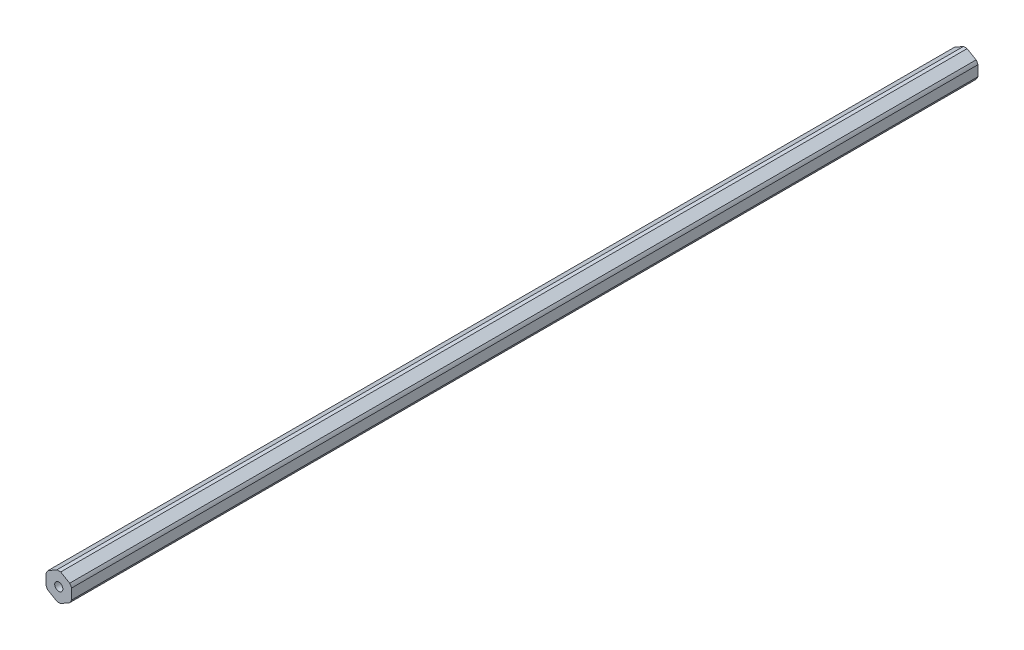
ISO-10303-21;
HEADER;
FILE_DESCRIPTION(('STEP AP214'),'2;1');
FILE_NAME('part.step','',(''),(''),'','','');
FILE_SCHEMA(('AUTOMOTIVE_DESIGN { 1 0 10303 214 1 1 1 1 }'));
ENDSEC;
DATA;
#1=APPLICATION_CONTEXT('core data for automotive mechanical design processes');
#2=APPLICATION_PROTOCOL_DEFINITION('international standard','automotive_design',2000,#1);
#3=PRODUCT_CONTEXT('',#1,'mechanical');
#4=PRODUCT('Part','Part','',(#3));
#5=PRODUCT_RELATED_PRODUCT_CATEGORY('part','',(#4));
#6=PRODUCT_DEFINITION_FORMATION('','',#4);
#7=PRODUCT_DEFINITION_CONTEXT('part definition',#1,'design');
#8=PRODUCT_DEFINITION('design','',#6,#7);
#9=PRODUCT_DEFINITION_SHAPE('','',#8);
#10=(LENGTH_UNIT() NAMED_UNIT(*) SI_UNIT(.MILLI.,.METRE.));
#11=(NAMED_UNIT(*) PLANE_ANGLE_UNIT() SI_UNIT($,.RADIAN.));
#12=(NAMED_UNIT(*) SI_UNIT($,.STERADIAN.) SOLID_ANGLE_UNIT());
#13=UNCERTAINTY_MEASURE_WITH_UNIT(LENGTH_MEASURE(1.E-05),#10,'distance_accuracy_value','');
#14=(GEOMETRIC_REPRESENTATION_CONTEXT(3) GLOBAL_UNCERTAINTY_ASSIGNED_CONTEXT((#13)) GLOBAL_UNIT_ASSIGNED_CONTEXT((#10,
#11,#12)) REPRESENTATION_CONTEXT('',''));
#15=CARTESIAN_POINT('',(0.,0.,0.));
#16=DIRECTION('',(0.,0.,1.));
#17=DIRECTION('',(1.,0.,0.));
#18=AXIS2_PLACEMENT_3D('',#15,#16,#17);
#19=CARTESIAN_POINT('',(6.35,0.,225.425));
#20=DIRECTION('',(-1.,0.,0.));
#21=DIRECTION('',(0.,-1.,0.));
#22=AXIS2_PLACEMENT_3D('',#19,#20,#21);
#23=PLANE('',#22);
#24=DIRECTION('',(0.,1.,0.));
#25=VECTOR('',#24,1.);
#26=CARTESIAN_POINT('',(6.35,0.,-225.425));
#27=LINE('',#26,#25);
#28=CARTESIAN_POINT('',(6.35,-2.59030191290514,-225.425));
#29=VERTEX_POINT('',#28);
#30=CARTESIAN_POINT('',(6.35,2.59030191290514,-225.425));
#31=VERTEX_POINT('',#30);
#32=EDGE_CURVE('E169',#29,#31,#27,.T.);
#33=ORIENTED_EDGE('',*,*,#32,.T.);
#34=DIRECTION('',(0.,0.,-1.));
#35=VECTOR('',#34,1.);
#36=CARTESIAN_POINT('',(6.35,2.59030191290514,225.425));
#37=LINE('',#36,#35);
#38=CARTESIAN_POINT('',(6.35,2.59030191290514,225.425));
#39=VERTEX_POINT('',#38);
#40=EDGE_CURVE('E11',#39,#31,#37,.T.);
#41=ORIENTED_EDGE('',*,*,#40,.F.);
#42=DIRECTION('',(0.,1.,0.));
#43=VECTOR('',#42,1.);
#44=CARTESIAN_POINT('',(6.35,0.,225.425));
#45=LINE('',#44,#43);
#46=CARTESIAN_POINT('',(6.35,-2.59030191290514,225.425));
#47=VERTEX_POINT('',#46);
#48=EDGE_CURVE('E227',#47,#39,#45,.T.);
#49=ORIENTED_EDGE('',*,*,#48,.F.);
#50=DIRECTION('',(0.,0.,-1.));
#51=VECTOR('',#50,1.);
#52=CARTESIAN_POINT('',(6.35,-2.59030191290514,225.425));
#53=LINE('',#52,#51);
#54=EDGE_CURVE('E165',#47,#29,#53,.T.);
#55=ORIENTED_EDGE('',*,*,#54,.T.);
#56=EDGE_LOOP('',(#33,#41,#49,#55));
#57=FACE_BOUND('',#56,.T.);
#58=ADVANCED_FACE('F45',(#57),#23,.F.);
#59=CARTESIAN_POINT('',(0.,0.,225.425));
#60=DIRECTION('',(0.,0.,-1.));
#61=DIRECTION('',(-1.,0.,0.));
#62=AXIS2_PLACEMENT_3D('',#59,#60,#61);
#63=CYLINDRICAL_SURFACE('',#62,6.858);
#64=CARTESIAN_POINT('',(0.,0.,-225.425));
#65=DIRECTION('',(0.,0.,1.));
#66=DIRECTION('',(1.,0.,0.));
#67=AXIS2_PLACEMENT_3D('',#64,#65,#66);
#68=CIRCLE('',#67,6.858);
#69=CARTESIAN_POINT('',(5.41826726004727,4.20411035757862,-225.425));
#70=VERTEX_POINT('',#69);
#71=EDGE_CURVE('E172',#31,#70,#68,.T.);
#72=ORIENTED_EDGE('',*,*,#71,.T.);
#73=DIRECTION('',(0.,0.,-1.));
#74=VECTOR('',#73,1.);
#75=CARTESIAN_POINT('',(5.41826726004727,4.20411035757862,225.425));
#76=LINE('',#75,#74);
#77=CARTESIAN_POINT('',(5.41826726004727,4.20411035757862,225.425));
#78=VERTEX_POINT('',#77);
#79=EDGE_CURVE('E53',#78,#70,#76,.T.);
#80=ORIENTED_EDGE('',*,*,#79,.F.);
#81=CARTESIAN_POINT('',(0.,0.,225.425));
#82=DIRECTION('',(0.,0.,1.));
#83=DIRECTION('',(1.,0.,0.));
#84=AXIS2_PLACEMENT_3D('',#81,#82,#83);
#85=CIRCLE('',#84,6.858);
#86=EDGE_CURVE('E117',#39,#78,#85,.T.);
#87=ORIENTED_EDGE('',*,*,#86,.F.);
#88=ORIENTED_EDGE('',*,*,#40,.T.);
#89=EDGE_LOOP('',(#72,#80,#87,#88));
#90=FACE_BOUND('',#89,.T.);
#91=ADVANCED_FACE('F261',(#90),#63,.T.);
#92=CARTESIAN_POINT('',(3.175,5.49926131403119,225.425));
#93=DIRECTION('',(-0.5,-0.866025403784439,0.));
#94=DIRECTION('',(0.866025403784439,-0.5,0.));
#95=AXIS2_PLACEMENT_3D('',#92,#93,#94);
#96=PLANE('',#95);
#97=DIRECTION('',(-0.866025403784439,0.5,0.));
#98=VECTOR('',#97,1.);
#99=CARTESIAN_POINT('',(3.175,5.49926131403119,-225.425));
#100=LINE('',#99,#98);
#101=CARTESIAN_POINT('',(0.931732739952729,6.79441227048375,-225.425));
#102=VERTEX_POINT('',#101);
#103=EDGE_CURVE('E175',#70,#102,#100,.T.);
#104=ORIENTED_EDGE('',*,*,#103,.T.);
#105=DIRECTION('',(0.,0.,-1.));
#106=VECTOR('',#105,1.);
#107=CARTESIAN_POINT('',(0.931732739952729,6.79441227048375,225.425));
#108=LINE('',#107,#106);
#109=CARTESIAN_POINT('',(0.931732739952729,6.79441227048375,225.425));
#110=VERTEX_POINT('',#109);
#111=EDGE_CURVE('E205',#110,#102,#108,.T.);
#112=ORIENTED_EDGE('',*,*,#111,.F.);
#113=DIRECTION('',(-0.866025403784439,0.5,0.));
#114=VECTOR('',#113,1.);
#115=CARTESIAN_POINT('',(3.175,5.49926131403119,225.425));
#116=LINE('',#115,#114);
#117=EDGE_CURVE('E213',#78,#110,#116,.T.);
#118=ORIENTED_EDGE('',*,*,#117,.F.);
#119=ORIENTED_EDGE('',*,*,#79,.T.);
#120=EDGE_LOOP('',(#104,#112,#118,#119));
#121=FACE_BOUND('',#120,.T.);
#122=ADVANCED_FACE('F211',(#121),#96,.F.);
#123=CARTESIAN_POINT('',(-0.931732739952724,6.79441227048375,-225.425));
#124=VERTEX_POINT('',#123);
#125=EDGE_CURVE('E176',#102,#124,#68,.T.);
#126=ORIENTED_EDGE('',*,*,#125,.T.);
#127=DIRECTION('',(0.,0.,-1.));
#128=VECTOR('',#127,1.);
#129=CARTESIAN_POINT('',(-0.931732739952724,6.79441227048375,225.425));
#130=LINE('',#129,#128);
#131=CARTESIAN_POINT('',(-0.931732739952724,6.79441227048375,225.425));
#132=VERTEX_POINT('',#131);
#133=EDGE_CURVE('E202',#132,#124,#130,.T.);
#134=ORIENTED_EDGE('',*,*,#133,.F.);
#135=EDGE_CURVE('E231',#110,#132,#85,.T.);
#136=ORIENTED_EDGE('',*,*,#135,.F.);
#137=ORIENTED_EDGE('',*,*,#111,.T.);
#138=EDGE_LOOP('',(#126,#134,#136,#137));
#139=FACE_BOUND('',#138,.T.);
#140=ADVANCED_FACE('F245',(#139),#63,.T.);
#141=CARTESIAN_POINT('',(-3.175,5.49926131403118,225.425));
#142=DIRECTION('',(0.500000000000001,-0.866025403784438,0.));
#143=DIRECTION('',(0.866025403784438,0.500000000000001,0.));
#144=AXIS2_PLACEMENT_3D('',#141,#142,#143);
#145=PLANE('',#144);
#146=DIRECTION('',(-0.866025403784438,-0.500000000000001,0.));
#147=VECTOR('',#146,1.);
#148=CARTESIAN_POINT('',(-3.175,5.49926131403118,-225.425));
#149=LINE('',#148,#147);
#150=CARTESIAN_POINT('',(-5.41826726004728,4.20411035757861,-225.425));
#151=VERTEX_POINT('',#150);
#152=EDGE_CURVE('E178',#124,#151,#149,.T.);
#153=ORIENTED_EDGE('',*,*,#152,.T.);
#154=DIRECTION('',(0.,0.,-1.));
#155=VECTOR('',#154,1.);
#156=CARTESIAN_POINT('',(-5.41826726004728,4.20411035757861,225.425));
#157=LINE('',#156,#155);
#158=CARTESIAN_POINT('',(-5.41826726004728,4.20411035757861,225.425));
#159=VERTEX_POINT('',#158);
#160=EDGE_CURVE('E199',#159,#151,#157,.T.);
#161=ORIENTED_EDGE('',*,*,#160,.F.);
#162=DIRECTION('',(-0.866025403784438,-0.500000000000001,0.));
#163=VECTOR('',#162,1.);
#164=CARTESIAN_POINT('',(-3.175,5.49926131403118,225.425));
#165=LINE('',#164,#163);
#166=EDGE_CURVE('E236',#132,#159,#165,.T.);
#167=ORIENTED_EDGE('',*,*,#166,.F.);
#168=ORIENTED_EDGE('',*,*,#133,.T.);
#169=EDGE_LOOP('',(#153,#161,#167,#168));
#170=FACE_BOUND('',#169,.T.);
#171=ADVANCED_FACE('F247',(#170),#145,.F.);
#172=CARTESIAN_POINT('',(-6.35,2.59030191290514,-225.425));
#173=VERTEX_POINT('',#172);
#174=EDGE_CURVE('E180',#151,#173,#68,.T.);
#175=ORIENTED_EDGE('',*,*,#174,.T.);
#176=DIRECTION('',(0.,0.,-1.));
#177=VECTOR('',#176,1.);
#178=CARTESIAN_POINT('',(-6.35,2.59030191290514,225.425));
#179=LINE('',#178,#177);
#180=CARTESIAN_POINT('',(-6.35,2.59030191290514,225.425));
#181=VERTEX_POINT('',#180);
#182=EDGE_CURVE('E196',#181,#173,#179,.T.);
#183=ORIENTED_EDGE('',*,*,#182,.F.);
#184=EDGE_CURVE('E237',#159,#181,#85,.T.);
#185=ORIENTED_EDGE('',*,*,#184,.F.);
#186=ORIENTED_EDGE('',*,*,#160,.T.);
#187=EDGE_LOOP('',(#175,#183,#185,#186));
#188=FACE_BOUND('',#187,.T.);
#189=ADVANCED_FACE('F248',(#188),#63,.T.);
#190=CARTESIAN_POINT('',(-6.35,0.,225.425));
#191=DIRECTION('',(1.,0.,0.));
#192=DIRECTION('',(0.,1.,0.));
#193=AXIS2_PLACEMENT_3D('',#190,#191,#192);
#194=PLANE('',#193);
#195=DIRECTION('',(0.,-1.,0.));
#196=VECTOR('',#195,1.);
#197=CARTESIAN_POINT('',(-6.35,0.,-225.425));
#198=LINE('',#197,#196);
#199=CARTESIAN_POINT('',(-6.35,-2.59030191290514,-225.425));
#200=VERTEX_POINT('',#199);
#201=EDGE_CURVE('E181',#173,#200,#198,.T.);
#202=ORIENTED_EDGE('',*,*,#201,.T.);
#203=DIRECTION('',(0.,0.,-1.));
#204=VECTOR('',#203,1.);
#205=CARTESIAN_POINT('',(-6.35,-2.59030191290514,225.425));
#206=LINE('',#205,#204);
#207=CARTESIAN_POINT('',(-6.35,-2.59030191290514,225.425));
#208=VERTEX_POINT('',#207);
#209=EDGE_CURVE('E193',#208,#200,#206,.T.);
#210=ORIENTED_EDGE('',*,*,#209,.F.);
#211=DIRECTION('',(0.,-1.,0.));
#212=VECTOR('',#211,1.);
#213=CARTESIAN_POINT('',(-6.35,0.,225.425));
#214=LINE('',#213,#212);
#215=EDGE_CURVE('E238',#181,#208,#214,.T.);
#216=ORIENTED_EDGE('',*,*,#215,.F.);
#217=ORIENTED_EDGE('',*,*,#182,.T.);
#218=EDGE_LOOP('',(#202,#210,#216,#217));
#219=FACE_BOUND('',#218,.T.);
#220=ADVANCED_FACE('F251',(#219),#194,.F.);
#221=CARTESIAN_POINT('',(-5.41826726004727,-4.20411035757862,-225.425));
#222=VERTEX_POINT('',#221);
#223=EDGE_CURVE('E183',#200,#222,#68,.T.);
#224=ORIENTED_EDGE('',*,*,#223,.T.);
#225=DIRECTION('',(0.,0.,-1.));
#226=VECTOR('',#225,1.);
#227=CARTESIAN_POINT('',(-5.41826726004727,-4.20411035757862,225.425));
#228=LINE('',#227,#226);
#229=CARTESIAN_POINT('',(-5.41826726004727,-4.20411035757862,225.425));
#230=VERTEX_POINT('',#229);
#231=EDGE_CURVE('E190',#230,#222,#228,.T.);
#232=ORIENTED_EDGE('',*,*,#231,.F.);
#233=EDGE_CURVE('E155',#208,#230,#85,.T.);
#234=ORIENTED_EDGE('',*,*,#233,.F.);
#235=ORIENTED_EDGE('',*,*,#209,.T.);
#236=EDGE_LOOP('',(#224,#232,#234,#235));
#237=FACE_BOUND('',#236,.T.);
#238=ADVANCED_FACE('F253',(#237),#63,.T.);
#239=CARTESIAN_POINT('',(-3.175,-5.49926131403119,225.425));
#240=DIRECTION('',(0.5,0.866025403784439,0.));
#241=DIRECTION('',(-0.866025403784439,0.5,0.));
#242=AXIS2_PLACEMENT_3D('',#239,#240,#241);
#243=PLANE('',#242);
#244=DIRECTION('',(0.866025403784439,-0.5,0.));
#245=VECTOR('',#244,1.);
#246=CARTESIAN_POINT('',(-3.175,-5.49926131403119,-225.425));
#247=LINE('',#246,#245);
#248=CARTESIAN_POINT('',(-0.931732739952731,-6.79441227048375,-225.425));
#249=VERTEX_POINT('',#248);
#250=EDGE_CURVE('E184',#222,#249,#247,.T.);
#251=ORIENTED_EDGE('',*,*,#250,.T.);
#252=DIRECTION('',(0.,0.,-1.));
#253=VECTOR('',#252,1.);
#254=CARTESIAN_POINT('',(-0.931732739952731,-6.79441227048375,225.425));
#255=LINE('',#254,#253);
#256=CARTESIAN_POINT('',(-0.931732739952731,-6.79441227048375,225.425));
#257=VERTEX_POINT('',#256);
#258=EDGE_CURVE('E160',#257,#249,#255,.T.);
#259=ORIENTED_EDGE('',*,*,#258,.F.);
#260=DIRECTION('',(0.866025403784439,-0.5,0.));
#261=VECTOR('',#260,1.);
#262=CARTESIAN_POINT('',(-3.175,-5.49926131403119,225.425));
#263=LINE('',#262,#261);
#264=EDGE_CURVE('E150',#230,#257,#263,.T.);
#265=ORIENTED_EDGE('',*,*,#264,.F.);
#266=ORIENTED_EDGE('',*,*,#231,.T.);
#267=EDGE_LOOP('',(#251,#259,#265,#266));
#268=FACE_BOUND('',#267,.T.);
#269=ADVANCED_FACE('F256',(#268),#243,.F.);
#270=CARTESIAN_POINT('',(0.931732739952723,-6.79441227048375,-225.425));
#271=VERTEX_POINT('',#270);
#272=EDGE_CURVE('E159',#249,#271,#68,.T.);
#273=ORIENTED_EDGE('',*,*,#272,.T.);
#274=DIRECTION('',(0.,0.,-1.));
#275=VECTOR('',#274,1.);
#276=CARTESIAN_POINT('',(0.931732739952723,-6.79441227048375,225.425));
#277=LINE('',#276,#275);
#278=CARTESIAN_POINT('',(0.931732739952723,-6.79441227048375,225.425));
#279=VERTEX_POINT('',#278);
#280=EDGE_CURVE('E156',#279,#271,#277,.T.);
#281=ORIENTED_EDGE('',*,*,#280,.F.);
#282=EDGE_CURVE('E144',#257,#279,#85,.T.);
#283=ORIENTED_EDGE('',*,*,#282,.F.);
#284=ORIENTED_EDGE('',*,*,#258,.T.);
#285=EDGE_LOOP('',(#273,#281,#283,#284));
#286=FACE_BOUND('',#285,.T.);
#287=ADVANCED_FACE('F157',(#286),#63,.T.);
#288=CARTESIAN_POINT('',(3.175,-5.49926131403118,225.425));
#289=DIRECTION('',(-0.5,0.866025403784438,0.));
#290=DIRECTION('',(-0.866025403784439,-0.5,0.));
#291=AXIS2_PLACEMENT_3D('',#288,#289,#290);
#292=PLANE('',#291);
#293=DIRECTION('',(0.866025403784439,0.5,0.));
#294=VECTOR('',#293,1.);
#295=CARTESIAN_POINT('',(3.175,-5.49926131403118,-225.425));
#296=LINE('',#295,#294);
#297=CARTESIAN_POINT('',(5.41826726004728,-4.20411035757861,-225.425));
#298=VERTEX_POINT('',#297);
#299=EDGE_CURVE('E103',#271,#298,#296,.T.);
#300=ORIENTED_EDGE('',*,*,#299,.T.);
#301=DIRECTION('',(0.,0.,-1.));
#302=VECTOR('',#301,1.);
#303=CARTESIAN_POINT('',(5.41826726004728,-4.20411035757861,225.425));
#304=LINE('',#303,#302);
#305=CARTESIAN_POINT('',(5.41826726004728,-4.20411035757861,225.425));
#306=VERTEX_POINT('',#305);
#307=EDGE_CURVE('E161',#306,#298,#304,.T.);
#308=ORIENTED_EDGE('',*,*,#307,.F.);
#309=DIRECTION('',(0.866025403784439,0.5,0.));
#310=VECTOR('',#309,1.);
#311=CARTESIAN_POINT('',(3.175,-5.49926131403118,225.425));
#312=LINE('',#311,#310);
#313=EDGE_CURVE('E148',#279,#306,#312,.T.);
#314=ORIENTED_EDGE('',*,*,#313,.F.);
#315=ORIENTED_EDGE('',*,*,#280,.T.);
#316=EDGE_LOOP('',(#300,#308,#314,#315));
#317=FACE_BOUND('',#316,.T.);
#318=ADVANCED_FACE('F163',(#317),#292,.F.);
#319=EDGE_CURVE('E109',#298,#29,#68,.T.);
#320=ORIENTED_EDGE('',*,*,#319,.T.);
#321=ORIENTED_EDGE('',*,*,#54,.F.);
#322=EDGE_CURVE('E61',#306,#47,#85,.T.);
#323=ORIENTED_EDGE('',*,*,#322,.F.);
#324=ORIENTED_EDGE('',*,*,#307,.T.);
#325=EDGE_LOOP('',(#320,#321,#323,#324));
#326=FACE_BOUND('',#325,.T.);
#327=ADVANCED_FACE('F258',(#326),#63,.T.);
#328=CARTESIAN_POINT('',(0.,0.,225.425));
#329=DIRECTION('',(0.,0.,1.));
#330=DIRECTION('',(1.,0.,0.));
#331=AXIS2_PLACEMENT_3D('',#328,#329,#330);
#332=PLANE('',#331);
#333=CARTESIAN_POINT('',(0.,0.,225.425));
#334=DIRECTION('',(0.,0.,1.));
#335=DIRECTION('',(1.,0.,0.));
#336=AXIS2_PLACEMENT_3D('',#333,#334,#335);
#337=CIRCLE('',#336,2.01929999999999);
#338=CARTESIAN_POINT('',(2.01929999999999,0.,225.425));
#339=VERTEX_POINT('',#338);
#340=EDGE_CURVE('E463',#339,#339,#337,.T.);
#341=ORIENTED_EDGE('',*,*,#340,.F.);
#342=EDGE_LOOP('',(#341));
#343=FACE_BOUND('',#342,.T.);
#344=ORIENTED_EDGE('',*,*,#48,.T.);
#345=ORIENTED_EDGE('',*,*,#86,.T.);
#346=ORIENTED_EDGE('',*,*,#117,.T.);
#347=ORIENTED_EDGE('',*,*,#135,.T.);
#348=ORIENTED_EDGE('',*,*,#166,.T.);
#349=ORIENTED_EDGE('',*,*,#184,.T.);
#350=ORIENTED_EDGE('',*,*,#215,.T.);
#351=ORIENTED_EDGE('',*,*,#233,.T.);
#352=ORIENTED_EDGE('',*,*,#264,.T.);
#353=ORIENTED_EDGE('',*,*,#282,.T.);
#354=ORIENTED_EDGE('',*,*,#313,.T.);
#355=ORIENTED_EDGE('',*,*,#322,.T.);
#356=EDGE_LOOP('',(#344,#345,#346,#347,#348,#349,#350,#351,#352,#353,#354,#355));
#357=FACE_BOUND('',#356,.T.);
#358=ADVANCED_FACE('F146',(#343,#357),#332,.T.);
#359=CARTESIAN_POINT('',(0.,0.,-225.425));
#360=DIRECTION('',(0.,0.,1.));
#361=DIRECTION('',(1.,0.,0.));
#362=AXIS2_PLACEMENT_3D('',#359,#360,#361);
#363=PLANE('',#362);
#364=CARTESIAN_POINT('',(0.,0.,-225.425));
#365=DIRECTION('',(0.,0.,-1.));
#366=DIRECTION('',(-1.,0.,0.));
#367=AXIS2_PLACEMENT_3D('',#364,#365,#366);
#368=CIRCLE('',#367,2.01929999999999);
#369=CARTESIAN_POINT('',(-2.01929999999999,0.,-225.425));
#370=VERTEX_POINT('',#369);
#371=EDGE_CURVE('E465',#370,#370,#368,.T.);
#372=ORIENTED_EDGE('',*,*,#371,.F.);
#373=EDGE_LOOP('',(#372));
#374=FACE_BOUND('',#373,.T.);
#375=ORIENTED_EDGE('',*,*,#32,.F.);
#376=ORIENTED_EDGE('',*,*,#319,.F.);
#377=ORIENTED_EDGE('',*,*,#299,.F.);
#378=ORIENTED_EDGE('',*,*,#272,.F.);
#379=ORIENTED_EDGE('',*,*,#250,.F.);
#380=ORIENTED_EDGE('',*,*,#223,.F.);
#381=ORIENTED_EDGE('',*,*,#201,.F.);
#382=ORIENTED_EDGE('',*,*,#174,.F.);
#383=ORIENTED_EDGE('',*,*,#152,.F.);
#384=ORIENTED_EDGE('',*,*,#125,.F.);
#385=ORIENTED_EDGE('',*,*,#103,.F.);
#386=ORIENTED_EDGE('',*,*,#71,.F.);
#387=EDGE_LOOP('',(#375,#376,#377,#378,#379,#380,#381,#382,#383,#384,#385,#386));
#388=FACE_BOUND('',#387,.T.);
#389=ADVANCED_FACE('F217',(#374,#388),#363,.F.);
#390=CARTESIAN_POINT('',(0.,0.,-210.34756));
#391=DIRECTION('',(0.,0.,-1.));
#392=DIRECTION('',(-1.,0.,0.));
#393=AXIS2_PLACEMENT_3D('',#390,#391,#392);
#394=CONICAL_SURFACE('',#393,2.01929999999999,1.02974425867665);
#395=CARTESIAN_POINT('',(0.,0.,-209.134242151998));
#396=VERTEX_POINT('',#395);
#397=VERTEX_LOOP('',#396);
#398=FACE_BOUND('',#397,.T.);
#399=CARTESIAN_POINT('',(0.,0.,-210.34756));
#400=DIRECTION('',(0.,0.,-1.));
#401=DIRECTION('',(-1.,0.,0.));
#402=AXIS2_PLACEMENT_3D('',#399,#400,#401);
#403=CIRCLE('',#402,2.01929999999999);
#404=CARTESIAN_POINT('',(-2.01929999999999,0.,-210.34756));
#405=VERTEX_POINT('',#404);
#406=EDGE_CURVE('E173',#405,#405,#403,.T.);
#407=ORIENTED_EDGE('',*,*,#406,.T.);
#408=EDGE_LOOP('',(#407));
#409=FACE_BOUND('',#408,.T.);
#410=ADVANCED_FACE('F350',(#398,#409),#394,.F.);
#411=CARTESIAN_POINT('',(0.,0.,-225.425));
#412=DIRECTION('',(0.,0.,-1.));
#413=DIRECTION('',(-1.,0.,0.));
#414=AXIS2_PLACEMENT_3D('',#411,#412,#413);
#415=CYLINDRICAL_SURFACE('',#414,2.01929999999999);
#416=ORIENTED_EDGE('',*,*,#406,.F.);
#417=EDGE_LOOP('',(#416));
#418=FACE_BOUND('',#417,.T.);
#419=ORIENTED_EDGE('',*,*,#371,.T.);
#420=EDGE_LOOP('',(#419));
#421=FACE_BOUND('',#420,.T.);
#422=ADVANCED_FACE('F361',(#418,#421),#415,.F.);
#423=CARTESIAN_POINT('',(0.,0.,210.34756));
#424=DIRECTION('',(0.,0.,1.));
#425=DIRECTION('',(1.,0.,0.));
#426=AXIS2_PLACEMENT_3D('',#423,#424,#425);
#427=CONICAL_SURFACE('',#426,2.01929999999999,1.02974425867665);
#428=CARTESIAN_POINT('',(0.,0.,209.134242151998));
#429=VERTEX_POINT('',#428);
#430=VERTEX_LOOP('',#429);
#431=FACE_BOUND('',#430,.T.);
#432=CARTESIAN_POINT('',(0.,0.,210.34756));
#433=DIRECTION('',(0.,0.,1.));
#434=DIRECTION('',(1.,0.,0.));
#435=AXIS2_PLACEMENT_3D('',#432,#433,#434);
#436=CIRCLE('',#435,2.01929999999999);
#437=CARTESIAN_POINT('',(2.01929999999999,0.,210.34756));
#438=VERTEX_POINT('',#437);
#439=EDGE_CURVE('E460',#438,#438,#436,.T.);
#440=ORIENTED_EDGE('',*,*,#439,.T.);
#441=EDGE_LOOP('',(#440));
#442=FACE_BOUND('',#441,.T.);
#443=ADVANCED_FACE('F373',(#431,#442),#427,.F.);
#444=CARTESIAN_POINT('',(0.,0.,225.425));
#445=DIRECTION('',(0.,0.,1.));
#446=DIRECTION('',(1.,0.,0.));
#447=AXIS2_PLACEMENT_3D('',#444,#445,#446);
#448=CYLINDRICAL_SURFACE('',#447,2.01929999999999);
#449=ORIENTED_EDGE('',*,*,#439,.F.);
#450=EDGE_LOOP('',(#449));
#451=FACE_BOUND('',#450,.T.);
#452=ORIENTED_EDGE('',*,*,#340,.T.);
#453=EDGE_LOOP('',(#452));
#454=FACE_BOUND('',#453,.T.);
#455=ADVANCED_FACE('F386',(#451,#454),#448,.F.);
#456=CLOSED_SHELL('',(#58,#91,#122,#140,#171,#189,#220,#238,#269,#287,#318,#327,#358,#389,#410,
#422,#443,#455));
#457=MANIFOLD_SOLID_BREP('B2',#456);
#458=ADVANCED_BREP_SHAPE_REPRESENTATION('',(#18,#457),#14);
#459=SHAPE_DEFINITION_REPRESENTATION(#9,#458);
ENDSEC;
END-ISO-10303-21;
